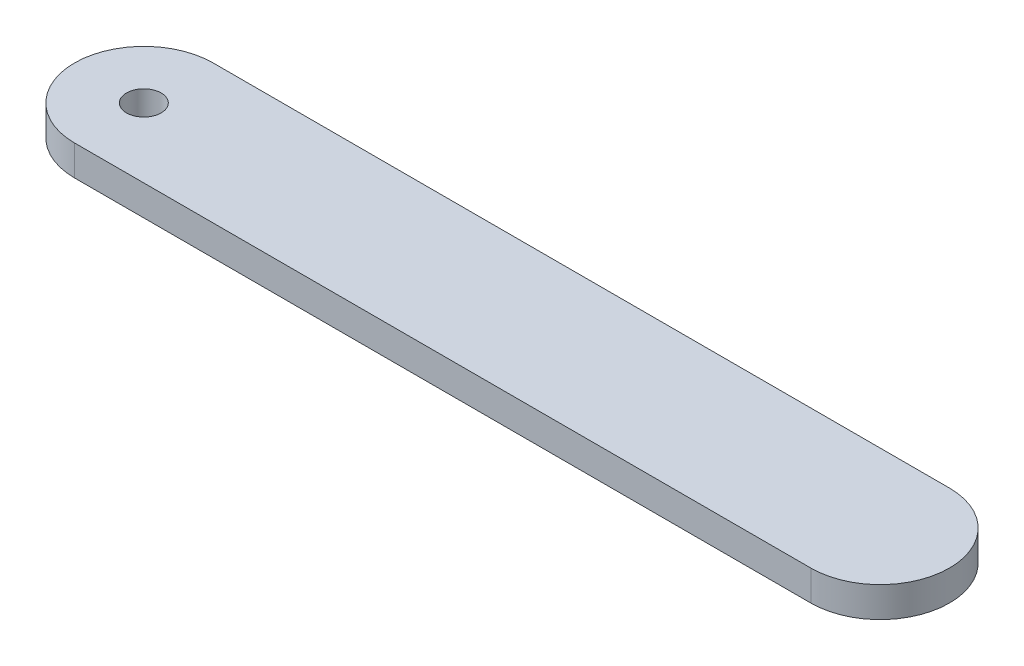
ISO-10303-21;
HEADER;
FILE_DESCRIPTION(('STEP AP214'),'2;1');
FILE_NAME('part.step','',(''),(''),'','','');
FILE_SCHEMA(('AUTOMOTIVE_DESIGN { 1 0 10303 214 1 1 1 1 }'));
ENDSEC;
DATA;
#1=APPLICATION_CONTEXT('core data for automotive mechanical design processes');
#2=APPLICATION_PROTOCOL_DEFINITION('international standard','automotive_design',2000,#1);
#3=PRODUCT_CONTEXT('',#1,'mechanical');
#4=PRODUCT('Part','Part','',(#3));
#5=PRODUCT_RELATED_PRODUCT_CATEGORY('part','',(#4));
#6=PRODUCT_DEFINITION_FORMATION('','',#4);
#7=PRODUCT_DEFINITION_CONTEXT('part definition',#1,'design');
#8=PRODUCT_DEFINITION('design','',#6,#7);
#9=PRODUCT_DEFINITION_SHAPE('','',#8);
#10=(LENGTH_UNIT() NAMED_UNIT(*) SI_UNIT(.MILLI.,.METRE.));
#11=(NAMED_UNIT(*) PLANE_ANGLE_UNIT() SI_UNIT($,.RADIAN.));
#12=(NAMED_UNIT(*) SI_UNIT($,.STERADIAN.) SOLID_ANGLE_UNIT());
#13=UNCERTAINTY_MEASURE_WITH_UNIT(LENGTH_MEASURE(1.E-05),#10,'distance_accuracy_value','');
#14=(GEOMETRIC_REPRESENTATION_CONTEXT(3) GLOBAL_UNCERTAINTY_ASSIGNED_CONTEXT((#13)) GLOBAL_UNIT_ASSIGNED_CONTEXT((#10,
#11,#12)) REPRESENTATION_CONTEXT('',''));
#15=CARTESIAN_POINT('',(0.,0.,0.));
#16=DIRECTION('',(0.,0.,1.));
#17=DIRECTION('',(1.,0.,0.));
#18=AXIS2_PLACEMENT_3D('',#15,#16,#17);
#19=CARTESIAN_POINT('',(0.,3.5,0.));
#20=DIRECTION('',(0.,-1.,0.));
#21=DIRECTION('',(0.,0.,-1.));
#22=AXIS2_PLACEMENT_3D('',#19,#20,#21);
#23=CYLINDRICAL_SURFACE('',#22,8.);
#24=CARTESIAN_POINT('',(0.,0.,0.));
#25=DIRECTION('',(0.,1.,0.));
#26=DIRECTION('',(0.,0.,1.));
#27=AXIS2_PLACEMENT_3D('',#24,#25,#26);
#28=CIRCLE('',#27,8.);
#29=CARTESIAN_POINT('',(0.,0.,-8.));
#30=VERTEX_POINT('',#29);
#31=CARTESIAN_POINT('',(0.,0.,8.));
#32=VERTEX_POINT('',#31);
#33=EDGE_CURVE('E102',#30,#32,#28,.T.);
#34=ORIENTED_EDGE('',*,*,#33,.T.);
#35=DIRECTION('',(0.,-1.,0.));
#36=VECTOR('',#35,1.);
#37=CARTESIAN_POINT('',(0.,3.5,8.));
#38=LINE('',#37,#36);
#39=CARTESIAN_POINT('',(0.,3.5,8.));
#40=VERTEX_POINT('',#39);
#41=EDGE_CURVE('E11',#40,#32,#38,.T.);
#42=ORIENTED_EDGE('',*,*,#41,.F.);
#43=CARTESIAN_POINT('',(0.,3.5,0.));
#44=DIRECTION('',(0.,1.,0.));
#45=DIRECTION('',(0.,0.,1.));
#46=AXIS2_PLACEMENT_3D('',#43,#44,#45);
#47=CIRCLE('',#46,8.);
#48=CARTESIAN_POINT('',(0.,3.5,-8.));
#49=VERTEX_POINT('',#48);
#50=EDGE_CURVE('E90',#49,#40,#47,.T.);
#51=ORIENTED_EDGE('',*,*,#50,.F.);
#52=DIRECTION('',(0.,-1.,0.));
#53=VECTOR('',#52,1.);
#54=CARTESIAN_POINT('',(0.,3.5,-8.));
#55=LINE('',#54,#53);
#56=EDGE_CURVE('E98',#49,#30,#55,.T.);
#57=ORIENTED_EDGE('',*,*,#56,.T.);
#58=EDGE_LOOP('',(#34,#42,#51,#57));
#59=FACE_BOUND('',#58,.T.);
#60=ADVANCED_FACE('F39',(#59),#23,.T.);
#61=CARTESIAN_POINT('',(0.,3.5,8.));
#62=DIRECTION('',(0.,0.,-1.));
#63=DIRECTION('',(-1.,0.,0.));
#64=AXIS2_PLACEMENT_3D('',#61,#62,#63);
#65=PLANE('',#64);
#66=DIRECTION('',(1.,0.,0.));
#67=VECTOR('',#66,1.);
#68=CARTESIAN_POINT('',(0.,0.,8.));
#69=LINE('',#68,#67);
#70=CARTESIAN_POINT('',(85.,0.,8.));
#71=VERTEX_POINT('',#70);
#72=EDGE_CURVE('E94',#32,#71,#69,.T.);
#73=ORIENTED_EDGE('',*,*,#72,.T.);
#74=DIRECTION('',(0.,-1.,0.));
#75=VECTOR('',#74,1.);
#76=CARTESIAN_POINT('',(85.,3.5,8.));
#77=LINE('',#76,#75);
#78=CARTESIAN_POINT('',(85.,3.5,8.));
#79=VERTEX_POINT('',#78);
#80=EDGE_CURVE('E47',#79,#71,#77,.T.);
#81=ORIENTED_EDGE('',*,*,#80,.F.);
#82=DIRECTION('',(1.,0.,0.));
#83=VECTOR('',#82,1.);
#84=CARTESIAN_POINT('',(0.,3.5,8.));
#85=LINE('',#84,#83);
#86=EDGE_CURVE('E85',#40,#79,#85,.T.);
#87=ORIENTED_EDGE('',*,*,#86,.F.);
#88=ORIENTED_EDGE('',*,*,#41,.T.);
#89=EDGE_LOOP('',(#73,#81,#87,#88));
#90=FACE_BOUND('',#89,.T.);
#91=ADVANCED_FACE('F93',(#90),#65,.F.);
#92=CARTESIAN_POINT('',(85.,3.5,0.));
#93=DIRECTION('',(0.,-1.,0.));
#94=DIRECTION('',(0.,0.,-1.));
#95=AXIS2_PLACEMENT_3D('',#92,#93,#94);
#96=CYLINDRICAL_SURFACE('',#95,8.);
#97=CARTESIAN_POINT('',(85.,0.,0.));
#98=DIRECTION('',(0.,1.,0.));
#99=DIRECTION('',(0.,0.,1.));
#100=AXIS2_PLACEMENT_3D('',#97,#98,#99);
#101=CIRCLE('',#100,8.);
#102=CARTESIAN_POINT('',(85.,0.,-8.));
#103=VERTEX_POINT('',#102);
#104=EDGE_CURVE('E72',#71,#103,#101,.T.);
#105=ORIENTED_EDGE('',*,*,#104,.T.);
#106=DIRECTION('',(0.,-1.,0.));
#107=VECTOR('',#106,1.);
#108=CARTESIAN_POINT('',(85.,3.5,-8.));
#109=LINE('',#108,#107);
#110=CARTESIAN_POINT('',(85.,3.5,-8.));
#111=VERTEX_POINT('',#110);
#112=EDGE_CURVE('E95',#111,#103,#109,.T.);
#113=ORIENTED_EDGE('',*,*,#112,.F.);
#114=CARTESIAN_POINT('',(85.,3.5,0.));
#115=DIRECTION('',(0.,1.,0.));
#116=DIRECTION('',(0.,0.,1.));
#117=AXIS2_PLACEMENT_3D('',#114,#115,#116);
#118=CIRCLE('',#117,8.);
#119=EDGE_CURVE('E88',#79,#111,#118,.T.);
#120=ORIENTED_EDGE('',*,*,#119,.F.);
#121=ORIENTED_EDGE('',*,*,#80,.T.);
#122=EDGE_LOOP('',(#105,#113,#120,#121));
#123=FACE_BOUND('',#122,.T.);
#124=ADVANCED_FACE('F96',(#123),#96,.T.);
#125=CARTESIAN_POINT('',(0.,3.5,-8.));
#126=DIRECTION('',(0.,0.,1.));
#127=DIRECTION('',(1.,0.,0.));
#128=AXIS2_PLACEMENT_3D('',#125,#126,#127);
#129=PLANE('',#128);
#130=DIRECTION('',(-1.,0.,0.));
#131=VECTOR('',#130,1.);
#132=CARTESIAN_POINT('',(0.,0.,-8.));
#133=LINE('',#132,#131);
#134=EDGE_CURVE('E78',#103,#30,#133,.T.);
#135=ORIENTED_EDGE('',*,*,#134,.T.);
#136=ORIENTED_EDGE('',*,*,#56,.F.);
#137=DIRECTION('',(-1.,0.,0.));
#138=VECTOR('',#137,1.);
#139=CARTESIAN_POINT('',(0.,3.5,-8.));
#140=LINE('',#139,#138);
#141=EDGE_CURVE('E55',#111,#49,#140,.T.);
#142=ORIENTED_EDGE('',*,*,#141,.F.);
#143=ORIENTED_EDGE('',*,*,#112,.T.);
#144=EDGE_LOOP('',(#135,#136,#142,#143));
#145=FACE_BOUND('',#144,.T.);
#146=ADVANCED_FACE('F110',(#145),#129,.F.);
#147=CARTESIAN_POINT('',(0.,3.5,0.));
#148=DIRECTION('',(0.,1.,0.));
#149=DIRECTION('',(0.,0.,1.));
#150=AXIS2_PLACEMENT_3D('',#147,#148,#149);
#151=PLANE('',#150);
#152=CARTESIAN_POINT('',(0.,3.5,0.));
#153=DIRECTION('',(0.,1.,0.));
#154=DIRECTION('',(0.,0.,1.));
#155=AXIS2_PLACEMENT_3D('',#152,#153,#154);
#156=CIRCLE('',#155,2.);
#157=CARTESIAN_POINT('',(0.,3.5,2.));
#158=VERTEX_POINT('',#157);
#159=EDGE_CURVE('E116',#158,#158,#156,.T.);
#160=ORIENTED_EDGE('',*,*,#159,.F.);
#161=EDGE_LOOP('',(#160));
#162=FACE_BOUND('',#161,.T.);
#163=ORIENTED_EDGE('',*,*,#50,.T.);
#164=ORIENTED_EDGE('',*,*,#86,.T.);
#165=ORIENTED_EDGE('',*,*,#119,.T.);
#166=ORIENTED_EDGE('',*,*,#141,.T.);
#167=EDGE_LOOP('',(#163,#164,#165,#166));
#168=FACE_BOUND('',#167,.T.);
#169=ADVANCED_FACE('F86',(#162,#168),#151,.T.);
#170=CARTESIAN_POINT('',(0.,0.,0.));
#171=DIRECTION('',(0.,1.,0.));
#172=DIRECTION('',(0.,0.,1.));
#173=AXIS2_PLACEMENT_3D('',#170,#171,#172);
#174=PLANE('',#173);
#175=CARTESIAN_POINT('',(0.,0.,0.));
#176=DIRECTION('',(0.,1.,0.));
#177=DIRECTION('',(0.,0.,1.));
#178=AXIS2_PLACEMENT_3D('',#175,#176,#177);
#179=CIRCLE('',#178,2.);
#180=CARTESIAN_POINT('',(0.,0.,2.));
#181=VERTEX_POINT('',#180);
#182=EDGE_CURVE('E105',#181,#181,#179,.T.);
#183=ORIENTED_EDGE('',*,*,#182,.T.);
#184=EDGE_LOOP('',(#183));
#185=FACE_BOUND('',#184,.T.);
#186=ORIENTED_EDGE('',*,*,#33,.F.);
#187=ORIENTED_EDGE('',*,*,#134,.F.);
#188=ORIENTED_EDGE('',*,*,#104,.F.);
#189=ORIENTED_EDGE('',*,*,#72,.F.);
#190=EDGE_LOOP('',(#186,#187,#188,#189));
#191=FACE_BOUND('',#190,.T.);
#192=ADVANCED_FACE('F113',(#185,#191),#174,.F.);
#193=CARTESIAN_POINT('',(0.,0.,0.));
#194=DIRECTION('',(0.,1.,0.));
#195=DIRECTION('',(0.,0.,1.));
#196=AXIS2_PLACEMENT_3D('',#193,#194,#195);
#197=CYLINDRICAL_SURFACE('',#196,2.);
#198=CARTESIAN_POINT('',(0.,0.,2.));
#199=CARTESIAN_POINT('',(0.,0.0364583333333334,2.));
#200=CARTESIAN_POINT('',(0.,0.0729166666666667,2.));
#201=CARTESIAN_POINT('',(0.,0.145833333333333,2.));
#202=CARTESIAN_POINT('',(0.,0.182291666666667,2.));
#203=CARTESIAN_POINT('',(0.,0.255208333333333,2.));
#204=CARTESIAN_POINT('',(0.,0.291666666666667,2.));
#205=CARTESIAN_POINT('',(0.,0.364583333333333,2.));
#206=CARTESIAN_POINT('',(0.,0.401041666666667,2.));
#207=CARTESIAN_POINT('',(0.,0.473958333333333,2.));
#208=CARTESIAN_POINT('',(0.,0.510416666666667,2.));
#209=CARTESIAN_POINT('',(0.,0.583333333333333,2.));
#210=CARTESIAN_POINT('',(0.,0.619791666666667,2.));
#211=CARTESIAN_POINT('',(0.,0.692708333333333,2.));
#212=CARTESIAN_POINT('',(0.,0.729166666666667,2.));
#213=CARTESIAN_POINT('',(0.,0.802083333333333,2.));
#214=CARTESIAN_POINT('',(0.,0.838541666666667,2.));
#215=CARTESIAN_POINT('',(0.,0.911458333333333,2.));
#216=CARTESIAN_POINT('',(0.,0.947916666666666,2.));
#217=CARTESIAN_POINT('',(0.,1.02083333333333,2.));
#218=CARTESIAN_POINT('',(0.,1.05729166666667,2.));
#219=CARTESIAN_POINT('',(0.,1.13020833333333,2.));
#220=CARTESIAN_POINT('',(0.,1.16666666666667,2.));
#221=CARTESIAN_POINT('',(0.,1.23958333333333,2.));
#222=CARTESIAN_POINT('',(0.,1.27604166666667,2.));
#223=CARTESIAN_POINT('',(0.,1.34895833333333,2.));
#224=CARTESIAN_POINT('',(0.,1.38541666666667,2.));
#225=CARTESIAN_POINT('',(0.,1.45833333333333,2.));
#226=CARTESIAN_POINT('',(0.,1.49479166666667,2.));
#227=CARTESIAN_POINT('',(0.,1.56770833333333,2.));
#228=CARTESIAN_POINT('',(0.,1.60416666666667,2.));
#229=CARTESIAN_POINT('',(0.,1.67708333333333,2.));
#230=CARTESIAN_POINT('',(0.,1.71354166666667,2.));
#231=CARTESIAN_POINT('',(0.,1.78645833333333,2.));
#232=CARTESIAN_POINT('',(0.,1.82291666666667,2.));
#233=CARTESIAN_POINT('',(0.,1.89583333333333,2.));
#234=CARTESIAN_POINT('',(0.,1.93229166666667,2.));
#235=CARTESIAN_POINT('',(0.,2.00520833333333,2.));
#236=CARTESIAN_POINT('',(0.,2.04166666666667,2.));
#237=CARTESIAN_POINT('',(0.,2.11458333333333,2.));
#238=CARTESIAN_POINT('',(0.,2.15104166666667,2.));
#239=CARTESIAN_POINT('',(0.,2.22395833333333,2.));
#240=CARTESIAN_POINT('',(0.,2.26041666666667,2.));
#241=CARTESIAN_POINT('',(0.,2.33333333333333,2.));
#242=CARTESIAN_POINT('',(0.,2.36979166666667,2.));
#243=CARTESIAN_POINT('',(0.,2.44270833333333,2.));
#244=CARTESIAN_POINT('',(0.,2.47916666666667,2.));
#245=CARTESIAN_POINT('',(0.,2.55208333333333,2.));
#246=CARTESIAN_POINT('',(0.,2.58854166666667,2.));
#247=CARTESIAN_POINT('',(0.,2.66145833333333,2.));
#248=CARTESIAN_POINT('',(0.,2.69791666666667,2.));
#249=CARTESIAN_POINT('',(0.,2.77083333333333,2.));
#250=CARTESIAN_POINT('',(0.,2.80729166666667,2.));
#251=CARTESIAN_POINT('',(0.,2.88020833333333,2.));
#252=CARTESIAN_POINT('',(0.,2.91666666666667,2.));
#253=CARTESIAN_POINT('',(0.,2.98958333333333,2.));
#254=CARTESIAN_POINT('',(0.,3.02604166666667,2.));
#255=CARTESIAN_POINT('',(0.,3.09895833333333,2.));
#256=CARTESIAN_POINT('',(0.,3.13541666666667,2.));
#257=CARTESIAN_POINT('',(0.,3.20833333333333,2.));
#258=CARTESIAN_POINT('',(0.,3.24479166666667,2.));
#259=CARTESIAN_POINT('',(0.,3.31770833333333,2.));
#260=CARTESIAN_POINT('',(0.,3.35416666666667,2.));
#261=CARTESIAN_POINT('',(0.,3.42708333333333,2.));
#262=CARTESIAN_POINT('',(0.,3.46354166666667,2.));
#263=CARTESIAN_POINT('',(0.,3.5,2.));
#264=B_SPLINE_CURVE_WITH_KNOTS('',3,(#198,#199,#200,#201,#202,#203,#204,#205,#206,#207,#208,
#209,#210,#211,#212,#213,#214,#215,#216,#217,#218,#219,#220,#221,#222,#223,#224,#225,#226,#227,
#228,#229,#230,#231,#232,#233,#234,#235,#236,#237,#238,#239,#240,#241,#242,#243,#244,#245,#246,
#247,#248,#249,#250,#251,#252,#253,#254,#255,#256,#257,#258,#259,#260,#261,#262,#263),
.UNSPECIFIED.,.F.,.F.,(4,2,2,2,2,2,2,2,2,2,2,2,2,2,2,2,2,2,2,2,2,2,2,2,2,2,2,2,2,2,2,2,4),(0.,
0.109375,0.21875,0.328125,0.4375,0.546875,0.65625,0.765625,0.875,0.984375,1.09375,1.203125,
1.3125,1.421875,1.53125,1.640625,1.75,1.859375,1.96875,2.078125,2.1875,2.296875,2.40625,
2.515625,2.625,2.734375,2.84375,2.953125,3.0625,3.171875,3.28125,3.390625,3.5),.UNSPECIFIED.);
#265=EDGE_CURVE('BSEAM123',#181,#158,#264,.T.);
#266=ORIENTED_EDGE('',*,*,#182,.F.);
#267=ORIENTED_EDGE('',*,*,#159,.T.);
#268=ORIENTED_EDGE('',*,*,#265,.T.);
#269=ORIENTED_EDGE('',*,*,#265,.F.);
#270=EDGE_LOOP('',(#266,#268,#267,#269));
#271=FACE_BOUND('',#270,.T.);
#272=ADVANCED_FACE('F123',(#271),#197,.F.);
#273=CLOSED_SHELL('',(#60,#91,#124,#146,#169,#192,#272));
#274=MANIFOLD_SOLID_BREP('B2',#273);
#275=ADVANCED_BREP_SHAPE_REPRESENTATION('',(#18,#274),#14);
#276=SHAPE_DEFINITION_REPRESENTATION(#9,#275);
ENDSEC;
END-ISO-10303-21;
